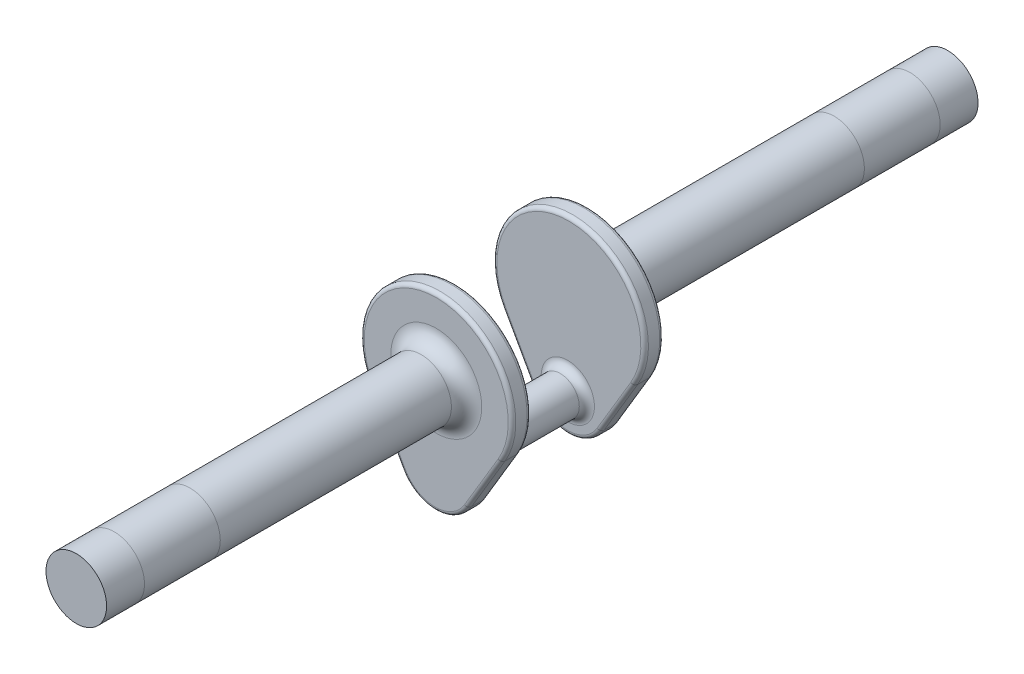
ISO-10303-21;
HEADER;
FILE_DESCRIPTION(('STEP AP214'),'2;1');
FILE_NAME('part.step','',(''),(''),'','','');
FILE_SCHEMA(('AUTOMOTIVE_DESIGN { 1 0 10303 214 1 1 1 1 }'));
ENDSEC;
DATA;
#1=APPLICATION_CONTEXT('core data for automotive mechanical design processes');
#2=APPLICATION_PROTOCOL_DEFINITION('international standard','automotive_design',2000,#1);
#3=PRODUCT_CONTEXT('',#1,'mechanical');
#4=PRODUCT('Part','Part','',(#3));
#5=PRODUCT_RELATED_PRODUCT_CATEGORY('part','',(#4));
#6=PRODUCT_DEFINITION_FORMATION('','',#4);
#7=PRODUCT_DEFINITION_CONTEXT('part definition',#1,'design');
#8=PRODUCT_DEFINITION('design','',#6,#7);
#9=PRODUCT_DEFINITION_SHAPE('','',#8);
#10=(LENGTH_UNIT() NAMED_UNIT(*) SI_UNIT(.MILLI.,.METRE.));
#11=(NAMED_UNIT(*) PLANE_ANGLE_UNIT() SI_UNIT($,.RADIAN.));
#12=(NAMED_UNIT(*) SI_UNIT($,.STERADIAN.) SOLID_ANGLE_UNIT());
#13=UNCERTAINTY_MEASURE_WITH_UNIT(LENGTH_MEASURE(1.E-05),#10,'distance_accuracy_value','');
#14=(GEOMETRIC_REPRESENTATION_CONTEXT(3) GLOBAL_UNCERTAINTY_ASSIGNED_CONTEXT((#13)) GLOBAL_UNIT_ASSIGNED_CONTEXT((#10,
#11,#12)) REPRESENTATION_CONTEXT('',''));
#15=CARTESIAN_POINT('',(0.,0.,0.));
#16=DIRECTION('',(0.,0.,1.));
#17=DIRECTION('',(1.,0.,0.));
#18=AXIS2_PLACEMENT_3D('',#15,#16,#17);
#19=CARTESIAN_POINT('',(0.,0.,-120.65));
#20=DIRECTION('',(0.,0.,1.));
#21=DIRECTION('',(1.,0.,0.));
#22=AXIS2_PLACEMENT_3D('',#19,#20,#21);
#23=CYLINDRICAL_SURFACE('',#22,10.1604447554047);
#24=CARTESIAN_POINT('',(0.,0.,-82.55));
#25=DIRECTION('',(0.,0.,-1.));
#26=DIRECTION('',(-1.,0.,0.));
#27=AXIS2_PLACEMENT_3D('',#24,#25,#26);
#28=CIRCLE('',#27,10.1604447554047);
#29=CARTESIAN_POINT('',(-10.1604447554047,0.,-82.55));
#30=VERTEX_POINT('',#29);
#31=EDGE_CURVE('E48',#30,#30,#28,.T.);
#32=ORIENTED_EDGE('',*,*,#31,.T.);
#33=EDGE_LOOP('',(#32));
#34=FACE_BOUND('',#33,.T.);
#35=CARTESIAN_POINT('',(0.,0.,-107.95));
#36=DIRECTION('',(0.,0.,-1.));
#37=DIRECTION('',(-1.,0.,0.));
#38=AXIS2_PLACEMENT_3D('',#35,#36,#37);
#39=CIRCLE('',#38,10.1604447554047);
#40=CARTESIAN_POINT('',(-10.1604447554047,0.,-107.95));
#41=VERTEX_POINT('',#40);
#42=EDGE_CURVE('E11',#41,#41,#39,.T.);
#43=ORIENTED_EDGE('',*,*,#42,.F.);
#44=EDGE_LOOP('',(#43));
#45=FACE_BOUND('',#44,.T.);
#46=ADVANCED_FACE('F39',(#34,#45),#23,.T.);
#47=CARTESIAN_POINT('',(0.,0.,-5.08));
#48=DIRECTION('',(0.,0.,1.));
#49=DIRECTION('',(1.,0.,0.));
#50=AXIS2_PLACEMENT_3D('',#47,#48,#49);
#51=CIRCLE('',#50,10.1604447554047);
#52=CARTESIAN_POINT('',(10.1604447554047,0.,-5.08));
#53=VERTEX_POINT('',#52);
#54=EDGE_CURVE('E268',#53,#53,#51,.F.);
#55=ORIENTED_EDGE('',*,*,#54,.T.);
#56=EDGE_LOOP('',(#55));
#57=FACE_BOUND('',#56,.T.);
#58=ORIENTED_EDGE('',*,*,#31,.F.);
#59=EDGE_LOOP('',(#58));
#60=FACE_BOUND('',#59,.T.);
#61=ADVANCED_FACE('F332',(#57,#60),#23,.T.);
#62=CARTESIAN_POINT('',(0.,0.,6.35));
#63=DIRECTION('',(0.,0.,1.));
#64=DIRECTION('',(1.,0.,0.));
#65=AXIS2_PLACEMENT_3D('',#62,#63,#64);
#66=PLANE('',#65);
#67=CARTESIAN_POINT('',(-0.358243610927282,-25.4,6.35));
#68=DIRECTION('',(0.,0.,1.));
#69=DIRECTION('',(1.,0.,0.));
#70=AXIS2_PLACEMENT_3D('',#67,#68,#69);
#71=CIRCLE('',#70,11.43);
#72=CARTESIAN_POINT('',(-10.3368464365435,-30.9742609957379,6.35));
#73=VERTEX_POINT('',#72);
#74=CARTESIAN_POINT('',(9.45918165202621,-31.2534657431579,6.35));
#75=VERTEX_POINT('',#74);
#76=EDGE_CURVE('E278',#73,#75,#71,.T.);
#77=ORIENTED_EDGE('',*,*,#76,.T.);
#78=DIRECTION('',(0.51211423824653,0.858917345840201,0.));
#79=VECTOR('',#78,1.);
#80=CARTESIAN_POINT('',(20.7256755551241,-12.3573165688888,6.35));
#81=LINE('',#80,#79);
#82=CARTESIAN_POINT('',(20.7256755551241,-12.3573165688888,6.35));
#83=VERTEX_POINT('',#82);
#84=EDGE_CURVE('E280',#75,#83,#81,.T.);
#85=ORIENTED_EDGE('',*,*,#84,.T.);
#86=CARTESIAN_POINT('',(0.,0.,6.35));
#87=DIRECTION('',(0.,0.,1.));
#88=DIRECTION('',(1.,0.,0.));
#89=AXIS2_PLACEMENT_3D('',#86,#87,#88);
#90=CIRCLE('',#89,24.13);
#91=CARTESIAN_POINT('',(-21.0659392985231,-11.7678843243355,6.35));
#92=VERTEX_POINT('',#91);
#93=EDGE_CURVE('E274',#83,#92,#90,.T.);
#94=ORIENTED_EDGE('',*,*,#93,.T.);
#95=DIRECTION('',(0.487686876267531,-0.873018619913927,0.));
#96=VECTOR('',#95,1.);
#97=CARTESIAN_POINT('',(-10.3368464365435,-30.9742609957379,6.35));
#98=LINE('',#97,#96);
#99=EDGE_CURVE('E276',#92,#73,#98,.T.);
#100=ORIENTED_EDGE('',*,*,#99,.T.);
#101=EDGE_LOOP('',(#77,#85,#94,#100));
#102=FACE_BOUND('',#101,.T.);
#103=CARTESIAN_POINT('',(-0.358243610927282,-25.4,6.35));
#104=DIRECTION('',(0.,0.,1.));
#105=DIRECTION('',(1.,0.,0.));
#106=AXIS2_PLACEMENT_3D('',#103,#104,#105);
#107=CIRCLE('',#106,8.92917244429606);
#108=CARTESIAN_POINT('',(8.57092883336878,-25.4,6.35));
#109=VERTEX_POINT('',#108);
#110=EDGE_CURVE('E265',#109,#109,#107,.F.);
#111=ORIENTED_EDGE('',*,*,#110,.T.);
#112=EDGE_LOOP('',(#111));
#113=FACE_BOUND('',#112,.T.);
#114=ADVANCED_FACE('F334',(#102,#113),#66,.T.);
#115=CARTESIAN_POINT('',(0.,0.,0.));
#116=DIRECTION('',(0.,0.,1.));
#117=DIRECTION('',(1.,0.,0.));
#118=AXIS2_PLACEMENT_3D('',#115,#116,#117);
#119=PLANE('',#118);
#120=CARTESIAN_POINT('',(0.,0.,0.));
#121=DIRECTION('',(0.,0.,1.));
#122=DIRECTION('',(1.,0.,0.));
#123=AXIS2_PLACEMENT_3D('',#120,#121,#122);
#124=CIRCLE('',#123,24.13);
#125=CARTESIAN_POINT('',(-21.0659392985231,-11.7678843243355,0.));
#126=VERTEX_POINT('',#125);
#127=CARTESIAN_POINT('',(20.7256755551241,-12.3573165688888,0.));
#128=VERTEX_POINT('',#127);
#129=EDGE_CURVE('E297',#126,#128,#124,.F.);
#130=ORIENTED_EDGE('',*,*,#129,.T.);
#131=DIRECTION('',(0.51211423824653,0.858917345840201,0.));
#132=VECTOR('',#131,1.);
#133=CARTESIAN_POINT('',(20.7256755551241,-12.3573165688888,0.));
#134=LINE('',#133,#132);
#135=CARTESIAN_POINT('',(9.45918165202621,-31.2534657431579,0.));
#136=VERTEX_POINT('',#135);
#137=EDGE_CURVE('E302',#128,#136,#134,.F.);
#138=ORIENTED_EDGE('',*,*,#137,.T.);
#139=CARTESIAN_POINT('',(-0.358243610927282,-25.4,0.));
#140=DIRECTION('',(0.,0.,1.));
#141=DIRECTION('',(1.,0.,0.));
#142=AXIS2_PLACEMENT_3D('',#139,#140,#141);
#143=CIRCLE('',#142,11.43);
#144=CARTESIAN_POINT('',(-10.3368464365435,-30.9742609957379,0.));
#145=VERTEX_POINT('',#144);
#146=EDGE_CURVE('E62',#136,#145,#143,.F.);
#147=ORIENTED_EDGE('',*,*,#146,.T.);
#148=DIRECTION('',(0.487686876267531,-0.873018619913927,0.));
#149=VECTOR('',#148,1.);
#150=CARTESIAN_POINT('',(-21.0659392985231,-11.7678843243355,0.));
#151=LINE('',#150,#149);
#152=EDGE_CURVE('E299',#145,#126,#151,.F.);
#153=ORIENTED_EDGE('',*,*,#152,.T.);
#154=EDGE_LOOP('',(#130,#138,#147,#153));
#155=FACE_BOUND('',#154,.T.);
#156=CARTESIAN_POINT('',(0.,0.,0.));
#157=DIRECTION('',(0.,0.,1.));
#158=DIRECTION('',(1.,0.,0.));
#159=AXIS2_PLACEMENT_3D('',#156,#157,#158);
#160=CIRCLE('',#159,15.2404447554047);
#161=CARTESIAN_POINT('',(15.2404447554047,0.,0.));
#162=VERTEX_POINT('',#161);
#163=EDGE_CURVE('E271',#162,#162,#160,.T.);
#164=ORIENTED_EDGE('',*,*,#163,.T.);
#165=EDGE_LOOP('',(#164));
#166=FACE_BOUND('',#165,.T.);
#167=ADVANCED_FACE('F342',(#155,#166),#119,.F.);
#168=CARTESIAN_POINT('',(0.,0.,6.35));
#169=DIRECTION('',(0.,0.,-1.));
#170=DIRECTION('',(-1.,0.,0.));
#171=AXIS2_PLACEMENT_3D('',#168,#169,#170);
#172=CYLINDRICAL_SURFACE('',#171,25.4);
#173=DIRECTION('',(0.,0.,-1.));
#174=VECTOR('',#173,1.);
#175=CARTESIAN_POINT('',(-22.1746729458138,-12.3872466571953,6.35));
#176=LINE('',#175,#174);
#177=CARTESIAN_POINT('',(-22.1746729458138,-12.3872466571953,5.08));
#178=VERTEX_POINT('',#177);
#179=CARTESIAN_POINT('',(-22.1746729458138,-12.3872466571953,1.27));
#180=VERTEX_POINT('',#179);
#181=EDGE_CURVE('E259',#178,#180,#176,.T.);
#182=ORIENTED_EDGE('',*,*,#181,.F.);
#183=CARTESIAN_POINT('',(0.,0.,5.08));
#184=DIRECTION('',(0.,0.,1.));
#185=DIRECTION('',(1.,0.,0.));
#186=AXIS2_PLACEMENT_3D('',#183,#184,#185);
#187=CIRCLE('',#186,25.4);
#188=CARTESIAN_POINT('',(21.8165005843411,-13.0077016514619,5.08));
#189=VERTEX_POINT('',#188);
#190=EDGE_CURVE('E306',#178,#189,#187,.F.);
#191=ORIENTED_EDGE('',*,*,#190,.T.);
#192=DIRECTION('',(0.,0.,-1.));
#193=VECTOR('',#192,1.);
#194=CARTESIAN_POINT('',(21.8165005843411,-13.0077016514619,6.35));
#195=LINE('',#194,#193);
#196=CARTESIAN_POINT('',(21.8165005843411,-13.0077016514619,1.27));
#197=VERTEX_POINT('',#196);
#198=EDGE_CURVE('E249',#189,#197,#195,.T.);
#199=ORIENTED_EDGE('',*,*,#198,.T.);
#200=CARTESIAN_POINT('',(0.,0.,1.27));
#201=DIRECTION('',(0.,0.,1.));
#202=DIRECTION('',(1.,0.,0.));
#203=AXIS2_PLACEMENT_3D('',#200,#201,#202);
#204=CIRCLE('',#203,25.4);
#205=EDGE_CURVE('E304',#197,#180,#204,.T.);
#206=ORIENTED_EDGE('',*,*,#205,.T.);
#207=EDGE_LOOP('',(#182,#191,#199,#206));
#208=FACE_BOUND('',#207,.T.);
#209=ADVANCED_FACE('F373',(#208),#172,.T.);
#210=CARTESIAN_POINT('',(-22.1746729458138,-12.3872466571953,6.35));
#211=DIRECTION('',(0.873018619913927,0.487686876267531,0.));
#212=DIRECTION('',(-0.487686876267531,0.873018619913927,0.));
#213=AXIS2_PLACEMENT_3D('',#210,#211,#212);
#214=PLANE('',#213);
#215=DIRECTION('',(0.,0.,-1.));
#216=VECTOR('',#215,1.);
#217=CARTESIAN_POINT('',(-11.4455800838342,-31.5936233285976,6.35));
#218=LINE('',#217,#216);
#219=CARTESIAN_POINT('',(-11.4455800838342,-31.5936233285976,5.08));
#220=VERTEX_POINT('',#219);
#221=CARTESIAN_POINT('',(-11.4455800838342,-31.5936233285976,1.27));
#222=VERTEX_POINT('',#221);
#223=EDGE_CURVE('E256',#220,#222,#218,.T.);
#224=ORIENTED_EDGE('',*,*,#223,.F.);
#225=DIRECTION('',(0.487686876267531,-0.873018619913927,0.));
#226=VECTOR('',#225,1.);
#227=CARTESIAN_POINT('',(-22.1746729458138,-12.3872466571953,5.08));
#228=LINE('',#227,#226);
#229=EDGE_CURVE('E295',#220,#178,#228,.F.);
#230=ORIENTED_EDGE('',*,*,#229,.T.);
#231=ORIENTED_EDGE('',*,*,#181,.T.);
#232=DIRECTION('',(0.487686876267531,-0.873018619913927,0.));
#233=VECTOR('',#232,1.);
#234=CARTESIAN_POINT('',(-22.1746729458138,-12.3872466571953,1.27));
#235=LINE('',#234,#233);
#236=EDGE_CURVE('E293',#180,#222,#235,.T.);
#237=ORIENTED_EDGE('',*,*,#236,.T.);
#238=EDGE_LOOP('',(#224,#230,#231,#237));
#239=FACE_BOUND('',#238,.T.);
#240=ADVANCED_FACE('F365',(#239),#214,.F.);
#241=CARTESIAN_POINT('',(-0.358243610927282,-25.4,6.35));
#242=DIRECTION('',(0.,0.,-1.));
#243=DIRECTION('',(-1.,0.,0.));
#244=AXIS2_PLACEMENT_3D('',#241,#242,#243);
#245=CYLINDRICAL_SURFACE('',#244,12.7);
#246=DIRECTION('',(0.,0.,-1.));
#247=VECTOR('',#246,1.);
#248=CARTESIAN_POINT('',(10.5500066812433,-31.9038508257309,6.35));
#249=LINE('',#248,#247);
#250=CARTESIAN_POINT('',(10.5500066812433,-31.9038508257309,5.08));
#251=VERTEX_POINT('',#250);
#252=CARTESIAN_POINT('',(10.5500066812433,-31.9038508257309,1.27));
#253=VERTEX_POINT('',#252);
#254=EDGE_CURVE('E253',#251,#253,#249,.T.);
#255=ORIENTED_EDGE('',*,*,#254,.F.);
#256=CARTESIAN_POINT('',(-0.358243610927282,-25.4,5.08));
#257=DIRECTION('',(0.,0.,1.));
#258=DIRECTION('',(1.,0.,0.));
#259=AXIS2_PLACEMENT_3D('',#256,#257,#258);
#260=CIRCLE('',#259,12.7);
#261=EDGE_CURVE('E291',#251,#220,#260,.F.);
#262=ORIENTED_EDGE('',*,*,#261,.T.);
#263=ORIENTED_EDGE('',*,*,#223,.T.);
#264=CARTESIAN_POINT('',(-0.358243610927282,-25.4,1.27));
#265=DIRECTION('',(0.,0.,1.));
#266=DIRECTION('',(1.,0.,0.));
#267=AXIS2_PLACEMENT_3D('',#264,#265,#266);
#268=CIRCLE('',#267,12.7);
#269=EDGE_CURVE('E289',#222,#253,#268,.T.);
#270=ORIENTED_EDGE('',*,*,#269,.T.);
#271=EDGE_LOOP('',(#255,#262,#263,#270));
#272=FACE_BOUND('',#271,.T.);
#273=ADVANCED_FACE('F356',(#272),#245,.T.);
#274=CARTESIAN_POINT('',(21.8165005843411,-13.0077016514619,6.35));
#275=DIRECTION('',(-0.858917345840201,0.51211423824653,0.));
#276=DIRECTION('',(-0.51211423824653,-0.858917345840201,0.));
#277=AXIS2_PLACEMENT_3D('',#274,#275,#276);
#278=PLANE('',#277);
#279=ORIENTED_EDGE('',*,*,#198,.F.);
#280=DIRECTION('',(0.51211423824653,0.858917345840201,0.));
#281=VECTOR('',#280,1.);
#282=CARTESIAN_POINT('',(10.5500066812433,-31.9038508257309,5.08));
#283=LINE('',#282,#281);
#284=EDGE_CURVE('E286',#189,#251,#283,.F.);
#285=ORIENTED_EDGE('',*,*,#284,.T.);
#286=ORIENTED_EDGE('',*,*,#254,.T.);
#287=DIRECTION('',(0.51211423824653,0.858917345840201,0.));
#288=VECTOR('',#287,1.);
#289=CARTESIAN_POINT('',(21.8165005843411,-13.0077016514619,1.27));
#290=LINE('',#289,#288);
#291=EDGE_CURVE('E283',#253,#197,#290,.T.);
#292=ORIENTED_EDGE('',*,*,#291,.T.);
#293=EDGE_LOOP('',(#279,#285,#286,#292));
#294=FACE_BOUND('',#293,.T.);
#295=ADVANCED_FACE('F348',(#294),#278,.F.);
#296=ORIENTED_EDGE('',*,*,#42,.T.);
#297=EDGE_LOOP('',(#296));
#298=FACE_BOUND('',#297,.T.);
#299=CARTESIAN_POINT('',(0.,0.,-120.65));
#300=DIRECTION('',(0.,0.,-1.));
#301=DIRECTION('',(-1.,0.,0.));
#302=AXIS2_PLACEMENT_3D('',#299,#300,#301);
#303=CIRCLE('',#302,10.1604447554047);
#304=CARTESIAN_POINT('',(-10.1604447554047,0.,-120.65));
#305=VERTEX_POINT('',#304);
#306=EDGE_CURVE('E246',#305,#305,#303,.T.);
#307=ORIENTED_EDGE('',*,*,#306,.F.);
#308=EDGE_LOOP('',(#307));
#309=FACE_BOUND('',#308,.T.);
#310=ADVANCED_FACE('F337',(#298,#309),#23,.T.);
#311=CARTESIAN_POINT('',(0.,0.,-120.65));
#312=DIRECTION('',(0.,0.,-1.));
#313=DIRECTION('',(-1.,0.,0.));
#314=AXIS2_PLACEMENT_3D('',#311,#312,#313);
#315=PLANE('',#314);
#316=ORIENTED_EDGE('',*,*,#306,.T.);
#317=EDGE_LOOP('',(#316));
#318=FACE_BOUND('',#317,.T.);
#319=ADVANCED_FACE('F347',(#318),#315,.T.);
#320=CARTESIAN_POINT('',(-0.358243610927282,-25.4,25.4));
#321=DIRECTION('',(0.,0.,-1.));
#322=DIRECTION('',(-1.,0.,0.));
#323=AXIS2_PLACEMENT_3D('',#320,#321,#322);
#324=CYLINDRICAL_SURFACE('',#323,6.38917244429606);
#325=CARTESIAN_POINT('',(-0.358243610927282,-25.4,8.89));
#326=DIRECTION('',(0.,0.,1.));
#327=DIRECTION('',(1.,0.,0.));
#328=AXIS2_PLACEMENT_3D('',#325,#326,#327);
#329=CIRCLE('',#328,6.38917244429606);
#330=CARTESIAN_POINT('',(-6.74741605522334,-25.4,8.89));
#331=VERTEX_POINT('',#330);
#332=EDGE_CURVE('E262',#331,#331,#329,.T.);
#333=CARTESIAN_POINT('',(-0.358243610927282,-25.4,41.91));
#334=DIRECTION('',(0.,0.,1.));
#335=DIRECTION('',(1.,0.,0.));
#336=AXIS2_PLACEMENT_3D('',#333,#334,#335);
#337=CIRCLE('',#336,6.38917244429606);
#338=CARTESIAN_POINT('',(-6.74741605522334,-25.4,41.91));
#339=VERTEX_POINT('',#338);
#340=EDGE_CURVE('E449',#339,#339,#337,.T.);
#341=CARTESIAN_POINT('',(-6.74741605522334,-25.4,8.89));
#342=CARTESIAN_POINT('',(-6.74741605522334,-25.4,9.23395833333333));
#343=CARTESIAN_POINT('',(-6.74741605522334,-25.4,9.57791666666666));
#344=CARTESIAN_POINT('',(-6.74741605522334,-25.4,10.2658333333333));
#345=CARTESIAN_POINT('',(-6.74741605522334,-25.4,10.6097916666667));
#346=CARTESIAN_POINT('',(-6.74741605522334,-25.4,11.2977083333333));
#347=CARTESIAN_POINT('',(-6.74741605522334,-25.4,11.6416666666667));
#348=CARTESIAN_POINT('',(-6.74741605522334,-25.4,12.3295833333333));
#349=CARTESIAN_POINT('',(-6.74741605522334,-25.4,12.6735416666667));
#350=CARTESIAN_POINT('',(-6.74741605522334,-25.4,13.3614583333333));
#351=CARTESIAN_POINT('',(-6.74741605522334,-25.4,13.7054166666667));
#352=CARTESIAN_POINT('',(-6.74741605522334,-25.4,14.3933333333333));
#353=CARTESIAN_POINT('',(-6.74741605522334,-25.4,14.7372916666667));
#354=CARTESIAN_POINT('',(-6.74741605522334,-25.4,15.4252083333333));
#355=CARTESIAN_POINT('',(-6.74741605522334,-25.4,15.7691666666667));
#356=CARTESIAN_POINT('',(-6.74741605522334,-25.4,16.4570833333333));
#357=CARTESIAN_POINT('',(-6.74741605522334,-25.4,16.8010416666667));
#358=CARTESIAN_POINT('',(-6.74741605522334,-25.4,17.4889583333333));
#359=CARTESIAN_POINT('',(-6.74741605522334,-25.4,17.8329166666667));
#360=CARTESIAN_POINT('',(-6.74741605522334,-25.4,18.5208333333333));
#361=CARTESIAN_POINT('',(-6.74741605522334,-25.4,18.8647916666667));
#362=CARTESIAN_POINT('',(-6.74741605522334,-25.4,19.5527083333333));
#363=CARTESIAN_POINT('',(-6.74741605522334,-25.4,19.8966666666667));
#364=CARTESIAN_POINT('',(-6.74741605522334,-25.4,20.5845833333333));
#365=CARTESIAN_POINT('',(-6.74741605522334,-25.4,20.9285416666667));
#366=CARTESIAN_POINT('',(-6.74741605522334,-25.4,21.6164583333333));
#367=CARTESIAN_POINT('',(-6.74741605522334,-25.4,21.9604166666667));
#368=CARTESIAN_POINT('',(-6.74741605522334,-25.4,22.6483333333333));
#369=CARTESIAN_POINT('',(-6.74741605522334,-25.4,22.9922916666667));
#370=CARTESIAN_POINT('',(-6.74741605522334,-25.4,23.6802083333333));
#371=CARTESIAN_POINT('',(-6.74741605522334,-25.4,24.0241666666667));
#372=CARTESIAN_POINT('',(-6.74741605522334,-25.4,24.7120833333333));
#373=CARTESIAN_POINT('',(-6.74741605522334,-25.4,25.0560416666667));
#374=CARTESIAN_POINT('',(-6.74741605522334,-25.4,25.7439583333333));
#375=CARTESIAN_POINT('',(-6.74741605522334,-25.4,26.0879166666667));
#376=CARTESIAN_POINT('',(-6.74741605522334,-25.4,26.7758333333333));
#377=CARTESIAN_POINT('',(-6.74741605522334,-25.4,27.1197916666667));
#378=CARTESIAN_POINT('',(-6.74741605522334,-25.4,27.8077083333333));
#379=CARTESIAN_POINT('',(-6.74741605522334,-25.4,28.1516666666667));
#380=CARTESIAN_POINT('',(-6.74741605522334,-25.4,28.8395833333333));
#381=CARTESIAN_POINT('',(-6.74741605522334,-25.4,29.1835416666667));
#382=CARTESIAN_POINT('',(-6.74741605522334,-25.4,29.8714583333333));
#383=CARTESIAN_POINT('',(-6.74741605522334,-25.4,30.2154166666667));
#384=CARTESIAN_POINT('',(-6.74741605522334,-25.4,30.9033333333333));
#385=CARTESIAN_POINT('',(-6.74741605522334,-25.4,31.2472916666667));
#386=CARTESIAN_POINT('',(-6.74741605522334,-25.4,31.9352083333333));
#387=CARTESIAN_POINT('',(-6.74741605522334,-25.4,32.2791666666667));
#388=CARTESIAN_POINT('',(-6.74741605522334,-25.4,32.9670833333333));
#389=CARTESIAN_POINT('',(-6.74741605522334,-25.4,33.3110416666667));
#390=CARTESIAN_POINT('',(-6.74741605522334,-25.4,33.9989583333333));
#391=CARTESIAN_POINT('',(-6.74741605522334,-25.4,34.3429166666667));
#392=CARTESIAN_POINT('',(-6.74741605522334,-25.4,35.0308333333333));
#393=CARTESIAN_POINT('',(-6.74741605522334,-25.4,35.3747916666667));
#394=CARTESIAN_POINT('',(-6.74741605522334,-25.4,36.0627083333333));
#395=CARTESIAN_POINT('',(-6.74741605522334,-25.4,36.4066666666667));
#396=CARTESIAN_POINT('',(-6.74741605522334,-25.4,37.0945833333333));
#397=CARTESIAN_POINT('',(-6.74741605522334,-25.4,37.4385416666667));
#398=CARTESIAN_POINT('',(-6.74741605522334,-25.4,38.1264583333333));
#399=CARTESIAN_POINT('',(-6.74741605522334,-25.4,38.4704166666667));
#400=CARTESIAN_POINT('',(-6.74741605522334,-25.4,39.1583333333333));
#401=CARTESIAN_POINT('',(-6.74741605522334,-25.4,39.5022916666667));
#402=CARTESIAN_POINT('',(-6.74741605522334,-25.4,40.1902083333333));
#403=CARTESIAN_POINT('',(-6.74741605522334,-25.4,40.5341666666667));
#404=CARTESIAN_POINT('',(-6.74741605522334,-25.4,41.2220833333333));
#405=CARTESIAN_POINT('',(-6.74741605522334,-25.4,41.5660416666667));
#406=CARTESIAN_POINT('',(-6.74741605522334,-25.4,41.91));
#407=B_SPLINE_CURVE_WITH_KNOTS('',3,(#341,#342,#343,#344,#345,#346,#347,#348,#349,#350,#351,
#352,#353,#354,#355,#356,#357,#358,#359,#360,#361,#362,#363,#364,#365,#366,#367,#368,#369,#370,
#371,#372,#373,#374,#375,#376,#377,#378,#379,#380,#381,#382,#383,#384,#385,#386,#387,#388,#389,
#390,#391,#392,#393,#394,#395,#396,#397,#398,#399,#400,#401,#402,#403,#404,#405,#406),
.UNSPECIFIED.,.F.,.F.,(4,2,2,2,2,2,2,2,2,2,2,2,2,2,2,2,2,2,2,2,2,2,2,2,2,2,2,2,2,2,2,2,4),(0.,
1.031875,2.06375,3.095625,4.1275,5.159375,6.19125,7.223125,8.255,9.286875,10.31875,11.350625,
12.3825,13.414375,14.44625,15.478125,16.51,17.541875,18.57375,19.605625,20.6375,21.669375,
22.70125,23.733125,24.765,25.796875,26.82875,27.860625,28.8925,29.924375,30.95625,31.988125,
33.02),.UNSPECIFIED.);
#408=EDGE_CURVE('BSEAM354',#331,#339,#407,.T.);
#409=ORIENTED_EDGE('',*,*,#332,.T.);
#410=ORIENTED_EDGE('',*,*,#340,.F.);
#411=ORIENTED_EDGE('',*,*,#408,.T.);
#412=ORIENTED_EDGE('',*,*,#408,.F.);
#413=EDGE_LOOP('',(#409,#411,#410,#412));
#414=FACE_BOUND('',#413,.T.);
#415=ADVANCED_FACE('F354',(#414),#324,.T.);
#416=CARTESIAN_POINT('',(-0.358243610927282,-25.4,8.89));
#417=DIRECTION('',(0.,0.,1.));
#418=DIRECTION('',(1.,0.,0.));
#419=AXIS2_PLACEMENT_3D('',#416,#417,#418);
#420=TOROIDAL_SURFACE('',#419,8.92917244429606,2.54);
#421=ORIENTED_EDGE('',*,*,#110,.F.);
#422=EDGE_LOOP('',(#421));
#423=FACE_BOUND('',#422,.T.);
#424=ORIENTED_EDGE('',*,*,#332,.F.);
#425=EDGE_LOOP('',(#424));
#426=FACE_BOUND('',#425,.T.);
#427=ADVANCED_FACE('F378',(#423,#426),#420,.F.);
#428=CARTESIAN_POINT('',(0.,0.,-5.08));
#429=DIRECTION('',(0.,0.,1.));
#430=DIRECTION('',(1.,0.,0.));
#431=AXIS2_PLACEMENT_3D('',#428,#429,#430);
#432=TOROIDAL_SURFACE('',#431,15.2404447554047,5.08);
#433=ORIENTED_EDGE('',*,*,#163,.F.);
#434=EDGE_LOOP('',(#433));
#435=FACE_BOUND('',#434,.T.);
#436=ORIENTED_EDGE('',*,*,#54,.F.);
#437=EDGE_LOOP('',(#436));
#438=FACE_BOUND('',#437,.T.);
#439=ADVANCED_FACE('F381',(#435,#438),#432,.F.);
#440=CARTESIAN_POINT('',(-21.0659392985231,-11.7678843243355,5.08));
#441=DIRECTION('',(-0.487686876267531,0.873018619913927,0.));
#442=DIRECTION('',(-0.873018619913927,-0.487686876267531,0.));
#443=AXIS2_PLACEMENT_3D('',#440,#441,#442);
#444=CYLINDRICAL_SURFACE('',#443,1.27);
#445=CARTESIAN_POINT('',(-21.0659392985231,-11.7678843243355,5.08));
#446=DIRECTION('',(-0.487686876267531,0.873018619913927,0.));
#447=DIRECTION('',(-0.873018619913927,-0.487686876267531,0.));
#448=AXIS2_PLACEMENT_3D('',#445,#446,#447);
#449=CIRCLE('',#448,1.27);
#450=EDGE_CURVE('E313',#178,#92,#449,.T.);
#451=ORIENTED_EDGE('',*,*,#450,.F.);
#452=ORIENTED_EDGE('',*,*,#229,.F.);
#453=CARTESIAN_POINT('',(-10.3368464365435,-30.9742609957379,5.08));
#454=DIRECTION('',(0.487686876267529,-0.873018619913928,0.));
#455=DIRECTION('',(0.873018619913928,0.487686876267529,0.));
#456=AXIS2_PLACEMENT_3D('',#453,#454,#455);
#457=CIRCLE('',#456,1.27);
#458=EDGE_CURVE('E250',#73,#220,#457,.T.);
#459=ORIENTED_EDGE('',*,*,#458,.F.);
#460=ORIENTED_EDGE('',*,*,#99,.F.);
#461=EDGE_LOOP('',(#451,#452,#459,#460));
#462=FACE_BOUND('',#461,.T.);
#463=ADVANCED_FACE('F385',(#462),#444,.T.);
#464=CARTESIAN_POINT('',(-0.358243610927282,-25.4,5.08));
#465=DIRECTION('',(0.,0.,1.));
#466=DIRECTION('',(1.,0.,0.));
#467=AXIS2_PLACEMENT_3D('',#464,#465,#466);
#468=TOROIDAL_SURFACE('',#467,11.43,1.27);
#469=ORIENTED_EDGE('',*,*,#458,.T.);
#470=ORIENTED_EDGE('',*,*,#261,.F.);
#471=CARTESIAN_POINT('',(9.45918165202621,-31.2534657431579,5.08));
#472=DIRECTION('',(0.512114238246528,0.858917345840203,0.));
#473=DIRECTION('',(-0.858917345840203,0.512114238246528,0.));
#474=AXIS2_PLACEMENT_3D('',#471,#472,#473);
#475=CIRCLE('',#474,1.27);
#476=EDGE_CURVE('E310',#75,#251,#475,.T.);
#477=ORIENTED_EDGE('',*,*,#476,.F.);
#478=ORIENTED_EDGE('',*,*,#76,.F.);
#479=EDGE_LOOP('',(#469,#470,#477,#478));
#480=FACE_BOUND('',#479,.T.);
#481=ADVANCED_FACE('F394',(#480),#468,.T.);
#482=CARTESIAN_POINT('',(0.,0.,5.08));
#483=DIRECTION('',(0.,0.,1.));
#484=DIRECTION('',(1.,0.,0.));
#485=AXIS2_PLACEMENT_3D('',#482,#483,#484);
#486=TOROIDAL_SURFACE('',#485,24.13,1.27);
#487=ORIENTED_EDGE('',*,*,#450,.T.);
#488=ORIENTED_EDGE('',*,*,#93,.F.);
#489=CARTESIAN_POINT('',(20.7256755551241,-12.3573165688888,5.08));
#490=DIRECTION('',(-0.512114238246531,-0.858917345840201,0.));
#491=DIRECTION('',(0.858917345840201,-0.512114238246531,0.));
#492=AXIS2_PLACEMENT_3D('',#489,#490,#491);
#493=CIRCLE('',#492,1.27);
#494=EDGE_CURVE('E308',#189,#83,#493,.T.);
#495=ORIENTED_EDGE('',*,*,#494,.F.);
#496=ORIENTED_EDGE('',*,*,#190,.F.);
#497=EDGE_LOOP('',(#487,#488,#495,#496));
#498=FACE_BOUND('',#497,.T.);
#499=ADVANCED_FACE('F390',(#498),#486,.T.);
#500=CARTESIAN_POINT('',(20.7256755551241,-12.3573165688888,5.08));
#501=DIRECTION('',(-0.51211423824653,-0.858917345840201,0.));
#502=DIRECTION('',(0.858917345840201,-0.51211423824653,0.));
#503=AXIS2_PLACEMENT_3D('',#500,#501,#502);
#504=CYLINDRICAL_SURFACE('',#503,1.27);
#505=ORIENTED_EDGE('',*,*,#476,.T.);
#506=ORIENTED_EDGE('',*,*,#284,.F.);
#507=ORIENTED_EDGE('',*,*,#494,.T.);
#508=ORIENTED_EDGE('',*,*,#84,.F.);
#509=EDGE_LOOP('',(#505,#506,#507,#508));
#510=FACE_BOUND('',#509,.T.);
#511=ADVANCED_FACE('F387',(#510),#504,.T.);
#512=CARTESIAN_POINT('',(-21.0659392985231,-11.7678843243355,1.27));
#513=DIRECTION('',(0.487686876267531,-0.873018619913927,0.));
#514=DIRECTION('',(0.873018619913927,0.487686876267531,0.));
#515=AXIS2_PLACEMENT_3D('',#512,#513,#514);
#516=CYLINDRICAL_SURFACE('',#515,1.27);
#517=CARTESIAN_POINT('',(-21.0659392985231,-11.7678843243355,1.27));
#518=DIRECTION('',(-0.487686876267531,0.873018619913927,0.));
#519=DIRECTION('',(-0.873018619913927,-0.487686876267531,0.));
#520=AXIS2_PLACEMENT_3D('',#517,#518,#519);
#521=CIRCLE('',#520,1.27);
#522=EDGE_CURVE('E320',#126,#180,#521,.T.);
#523=ORIENTED_EDGE('',*,*,#522,.F.);
#524=ORIENTED_EDGE('',*,*,#152,.F.);
#525=CARTESIAN_POINT('',(-10.3368464365435,-30.9742609957379,1.27));
#526=DIRECTION('',(0.487686876267532,-0.873018619913926,0.));
#527=DIRECTION('',(0.873018619913927,0.487686876267532,0.));
#528=AXIS2_PLACEMENT_3D('',#525,#526,#527);
#529=CIRCLE('',#528,1.27);
#530=EDGE_CURVE('E311',#222,#145,#529,.T.);
#531=ORIENTED_EDGE('',*,*,#530,.F.);
#532=ORIENTED_EDGE('',*,*,#236,.F.);
#533=EDGE_LOOP('',(#523,#524,#531,#532));
#534=FACE_BOUND('',#533,.T.);
#535=ADVANCED_FACE('F41',(#534),#516,.T.);
#536=CARTESIAN_POINT('',(-0.358243610927282,-25.4,1.27));
#537=DIRECTION('',(0.,0.,1.));
#538=DIRECTION('',(1.,0.,0.));
#539=AXIS2_PLACEMENT_3D('',#536,#537,#538);
#540=TOROIDAL_SURFACE('',#539,11.43,1.27);
#541=ORIENTED_EDGE('',*,*,#530,.T.);
#542=ORIENTED_EDGE('',*,*,#146,.F.);
#543=CARTESIAN_POINT('',(9.45918165202622,-31.2534657431578,1.27));
#544=DIRECTION('',(0.512114238246533,0.8589173458402,0.));
#545=DIRECTION('',(-0.8589173458402,0.512114238246533,0.));
#546=AXIS2_PLACEMENT_3D('',#543,#544,#545);
#547=CIRCLE('',#546,1.27);
#548=EDGE_CURVE('E55',#253,#136,#547,.T.);
#549=ORIENTED_EDGE('',*,*,#548,.F.);
#550=ORIENTED_EDGE('',*,*,#269,.F.);
#551=EDGE_LOOP('',(#541,#542,#549,#550));
#552=FACE_BOUND('',#551,.T.);
#553=ADVANCED_FACE('F408',(#552),#540,.T.);
#554=CARTESIAN_POINT('',(0.,0.,1.27));
#555=DIRECTION('',(0.,0.,1.));
#556=DIRECTION('',(1.,0.,0.));
#557=AXIS2_PLACEMENT_3D('',#554,#555,#556);
#558=TOROIDAL_SURFACE('',#557,24.13,1.27);
#559=ORIENTED_EDGE('',*,*,#522,.T.);
#560=ORIENTED_EDGE('',*,*,#205,.F.);
#561=CARTESIAN_POINT('',(20.7256755551241,-12.3573165688888,1.27));
#562=DIRECTION('',(-0.512114238246531,-0.858917345840201,0.));
#563=DIRECTION('',(0.858917345840201,-0.512114238246531,0.));
#564=AXIS2_PLACEMENT_3D('',#561,#562,#563);
#565=CIRCLE('',#564,1.27);
#566=EDGE_CURVE('E245',#128,#197,#565,.T.);
#567=ORIENTED_EDGE('',*,*,#566,.F.);
#568=ORIENTED_EDGE('',*,*,#129,.F.);
#569=EDGE_LOOP('',(#559,#560,#567,#568));
#570=FACE_BOUND('',#569,.T.);
#571=ADVANCED_FACE('F406',(#570),#558,.T.);
#572=CARTESIAN_POINT('',(20.7256755551241,-12.3573165688888,1.27));
#573=DIRECTION('',(0.51211423824653,0.858917345840201,0.));
#574=DIRECTION('',(-0.858917345840201,0.51211423824653,0.));
#575=AXIS2_PLACEMENT_3D('',#572,#573,#574);
#576=CYLINDRICAL_SURFACE('',#575,1.27);
#577=ORIENTED_EDGE('',*,*,#548,.T.);
#578=ORIENTED_EDGE('',*,*,#137,.F.);
#579=ORIENTED_EDGE('',*,*,#566,.T.);
#580=ORIENTED_EDGE('',*,*,#291,.F.);
#581=EDGE_LOOP('',(#577,#578,#579,#580));
#582=FACE_BOUND('',#581,.T.);
#583=ADVANCED_FACE('F402',(#582),#576,.T.);
#584=CARTESIAN_POINT('',(0.,0.,171.45));
#585=DIRECTION('',(0.,0.,-1.));
#586=DIRECTION('',(1.,0.,0.));
#587=AXIS2_PLACEMENT_3D('',#584,#585,#586);
#588=CYLINDRICAL_SURFACE('',#587,10.1604447554047);
#589=CARTESIAN_POINT('',(0.,0.,133.35));
#590=DIRECTION('',(0.,0.,-1.));
#591=DIRECTION('',(-1.,0.,0.));
#592=AXIS2_PLACEMENT_3D('',#589,#590,#591);
#593=CIRCLE('',#592,10.1604447554047);
#594=CARTESIAN_POINT('',(-10.1604447554047,0.,133.35));
#595=VERTEX_POINT('',#594);
#596=EDGE_CURVE('E223',#595,#595,#593,.T.);
#597=ORIENTED_EDGE('',*,*,#596,.F.);
#598=EDGE_LOOP('',(#597));
#599=FACE_BOUND('',#598,.T.);
#600=CARTESIAN_POINT('',(0.,0.,158.75));
#601=DIRECTION('',(0.,0.,-1.));
#602=DIRECTION('',(-1.,0.,0.));
#603=AXIS2_PLACEMENT_3D('',#600,#601,#602);
#604=CIRCLE('',#603,10.1604447554047);
#605=CARTESIAN_POINT('',(-10.1604447554047,0.,158.75));
#606=VERTEX_POINT('',#605);
#607=EDGE_CURVE('E241',#606,#606,#604,.T.);
#608=ORIENTED_EDGE('',*,*,#607,.T.);
#609=EDGE_LOOP('',(#608));
#610=FACE_BOUND('',#609,.T.);
#611=ADVANCED_FACE('F405',(#599,#610),#588,.T.);
#612=CARTESIAN_POINT('',(0.,0.,55.88));
#613=DIRECTION('',(0.,0.,1.));
#614=DIRECTION('',(1.,0.,0.));
#615=AXIS2_PLACEMENT_3D('',#612,#613,#614);
#616=CIRCLE('',#615,10.1604447554047);
#617=CARTESIAN_POINT('',(10.1604447554047,0.,55.88));
#618=VERTEX_POINT('',#617);
#619=EDGE_CURVE('E187',#618,#618,#616,.F.);
#620=ORIENTED_EDGE('',*,*,#619,.F.);
#621=EDGE_LOOP('',(#620));
#622=FACE_BOUND('',#621,.T.);
#623=ORIENTED_EDGE('',*,*,#596,.T.);
#624=EDGE_LOOP('',(#623));
#625=FACE_BOUND('',#624,.T.);
#626=ADVANCED_FACE('F465',(#622,#625),#588,.T.);
#627=CARTESIAN_POINT('',(0.,0.,44.45));
#628=DIRECTION('',(0.,0.,-1.));
#629=DIRECTION('',(1.,0.,0.));
#630=AXIS2_PLACEMENT_3D('',#627,#628,#629);
#631=PLANE('',#630);
#632=CARTESIAN_POINT('',(-0.358243610927282,-25.4,44.45));
#633=DIRECTION('',(0.,0.,1.));
#634=DIRECTION('',(1.,0.,0.));
#635=AXIS2_PLACEMENT_3D('',#632,#633,#634);
#636=CIRCLE('',#635,11.43);
#637=CARTESIAN_POINT('',(-10.3368464365435,-30.9742609957379,44.45));
#638=VERTEX_POINT('',#637);
#639=CARTESIAN_POINT('',(9.45918165202621,-31.2534657431579,44.45));
#640=VERTEX_POINT('',#639);
#641=EDGE_CURVE('E177',#638,#640,#636,.T.);
#642=ORIENTED_EDGE('',*,*,#641,.F.);
#643=DIRECTION('',(0.487686876267531,-0.873018619913927,0.));
#644=VECTOR('',#643,1.);
#645=CARTESIAN_POINT('',(-10.3368464365435,-30.9742609957379,44.45));
#646=LINE('',#645,#644);
#647=CARTESIAN_POINT('',(-21.0659392985231,-11.7678843243355,44.45));
#648=VERTEX_POINT('',#647);
#649=EDGE_CURVE('E182',#648,#638,#646,.T.);
#650=ORIENTED_EDGE('',*,*,#649,.F.);
#651=CARTESIAN_POINT('',(0.,0.,44.45));
#652=DIRECTION('',(0.,0.,1.));
#653=DIRECTION('',(1.,0.,0.));
#654=AXIS2_PLACEMENT_3D('',#651,#652,#653);
#655=CIRCLE('',#654,24.13);
#656=CARTESIAN_POINT('',(20.7256755551241,-12.3573165688888,44.45));
#657=VERTEX_POINT('',#656);
#658=EDGE_CURVE('E159',#657,#648,#655,.T.);
#659=ORIENTED_EDGE('',*,*,#658,.F.);
#660=DIRECTION('',(0.51211423824653,0.858917345840201,0.));
#661=VECTOR('',#660,1.);
#662=CARTESIAN_POINT('',(20.7256755551241,-12.3573165688888,44.45));
#663=LINE('',#662,#661);
#664=EDGE_CURVE('E171',#640,#657,#663,.T.);
#665=ORIENTED_EDGE('',*,*,#664,.F.);
#666=EDGE_LOOP('',(#642,#650,#659,#665));
#667=FACE_BOUND('',#666,.T.);
#668=CARTESIAN_POINT('',(-0.358243610927282,-25.4,44.45));
#669=DIRECTION('',(0.,0.,1.));
#670=DIRECTION('',(1.,0.,0.));
#671=AXIS2_PLACEMENT_3D('',#668,#669,#670);
#672=CIRCLE('',#671,8.92917244429606);
#673=CARTESIAN_POINT('',(8.57092883336878,-25.4,44.45));
#674=VERTEX_POINT('',#673);
#675=EDGE_CURVE('E451',#674,#674,#672,.F.);
#676=ORIENTED_EDGE('',*,*,#675,.F.);
#677=EDGE_LOOP('',(#676));
#678=FACE_BOUND('',#677,.T.);
#679=ADVANCED_FACE('F179',(#667,#678),#631,.T.);
#680=CARTESIAN_POINT('',(0.,0.,50.8));
#681=DIRECTION('',(0.,0.,-1.));
#682=DIRECTION('',(1.,0.,0.));
#683=AXIS2_PLACEMENT_3D('',#680,#681,#682);
#684=PLANE('',#683);
#685=CARTESIAN_POINT('',(0.,0.,50.8));
#686=DIRECTION('',(0.,0.,1.));
#687=DIRECTION('',(1.,0.,0.));
#688=AXIS2_PLACEMENT_3D('',#685,#686,#687);
#689=CIRCLE('',#688,24.13);
#690=CARTESIAN_POINT('',(-21.0659392985231,-11.7678843243355,50.8));
#691=VERTEX_POINT('',#690);
#692=CARTESIAN_POINT('',(20.7256755551241,-12.3573165688888,50.8));
#693=VERTEX_POINT('',#692);
#694=EDGE_CURVE('E208',#691,#693,#689,.F.);
#695=ORIENTED_EDGE('',*,*,#694,.F.);
#696=DIRECTION('',(0.487686876267531,-0.873018619913927,0.));
#697=VECTOR('',#696,1.);
#698=CARTESIAN_POINT('',(-21.0659392985231,-11.7678843243355,50.8));
#699=LINE('',#698,#697);
#700=CARTESIAN_POINT('',(-10.3368464365435,-30.9742609957379,50.8));
#701=VERTEX_POINT('',#700);
#702=EDGE_CURVE('E211',#701,#691,#699,.F.);
#703=ORIENTED_EDGE('',*,*,#702,.F.);
#704=CARTESIAN_POINT('',(-0.358243610927282,-25.4,50.8));
#705=DIRECTION('',(0.,0.,1.));
#706=DIRECTION('',(1.,0.,0.));
#707=AXIS2_PLACEMENT_3D('',#704,#705,#706);
#708=CIRCLE('',#707,11.43);
#709=CARTESIAN_POINT('',(9.45918165202621,-31.2534657431579,50.8));
#710=VERTEX_POINT('',#709);
#711=EDGE_CURVE('E214',#710,#701,#708,.F.);
#712=ORIENTED_EDGE('',*,*,#711,.F.);
#713=DIRECTION('',(0.51211423824653,0.858917345840201,0.));
#714=VECTOR('',#713,1.);
#715=CARTESIAN_POINT('',(20.7256755551241,-12.3573165688888,50.8));
#716=LINE('',#715,#714);
#717=EDGE_CURVE('E217',#693,#710,#716,.F.);
#718=ORIENTED_EDGE('',*,*,#717,.F.);
#719=EDGE_LOOP('',(#695,#703,#712,#718));
#720=FACE_BOUND('',#719,.T.);
#721=CARTESIAN_POINT('',(0.,0.,50.8));
#722=DIRECTION('',(0.,0.,1.));
#723=DIRECTION('',(1.,0.,0.));
#724=AXIS2_PLACEMENT_3D('',#721,#722,#723);
#725=CIRCLE('',#724,15.2404447554047);
#726=CARTESIAN_POINT('',(15.2404447554047,0.,50.8));
#727=VERTEX_POINT('',#726);
#728=EDGE_CURVE('E183',#727,#727,#725,.T.);
#729=ORIENTED_EDGE('',*,*,#728,.F.);
#730=EDGE_LOOP('',(#729));
#731=FACE_BOUND('',#730,.T.);
#732=ADVANCED_FACE('F520',(#720,#731),#684,.F.);
#733=CARTESIAN_POINT('',(0.,0.,44.45));
#734=DIRECTION('',(0.,0.,1.));
#735=DIRECTION('',(-1.,0.,0.));
#736=AXIS2_PLACEMENT_3D('',#733,#734,#735);
#737=CYLINDRICAL_SURFACE('',#736,25.4);
#738=DIRECTION('',(0.,0.,1.));
#739=VECTOR('',#738,1.);
#740=CARTESIAN_POINT('',(-22.1746729458138,-12.3872466571953,44.45));
#741=LINE('',#740,#739);
#742=CARTESIAN_POINT('',(-22.1746729458138,-12.3872466571953,45.72));
#743=VERTEX_POINT('',#742);
#744=CARTESIAN_POINT('',(-22.1746729458138,-12.3872466571953,49.53));
#745=VERTEX_POINT('',#744);
#746=EDGE_CURVE('E452',#743,#745,#741,.T.);
#747=ORIENTED_EDGE('',*,*,#746,.T.);
#748=CARTESIAN_POINT('',(0.,0.,49.53));
#749=DIRECTION('',(0.,0.,1.));
#750=DIRECTION('',(1.,0.,0.));
#751=AXIS2_PLACEMENT_3D('',#748,#749,#750);
#752=CIRCLE('',#751,25.4);
#753=CARTESIAN_POINT('',(21.8165005843411,-13.0077016514619,49.53));
#754=VERTEX_POINT('',#753);
#755=EDGE_CURVE('E220',#754,#745,#752,.T.);
#756=ORIENTED_EDGE('',*,*,#755,.F.);
#757=DIRECTION('',(0.,0.,1.));
#758=VECTOR('',#757,1.);
#759=CARTESIAN_POINT('',(21.8165005843411,-13.0077016514619,44.45));
#760=LINE('',#759,#758);
#761=CARTESIAN_POINT('',(21.8165005843411,-13.0077016514619,45.72));
#762=VERTEX_POINT('',#761);
#763=EDGE_CURVE('E483',#762,#754,#760,.T.);
#764=ORIENTED_EDGE('',*,*,#763,.F.);
#765=CARTESIAN_POINT('',(0.,0.,45.72));
#766=DIRECTION('',(0.,0.,1.));
#767=DIRECTION('',(1.,0.,0.));
#768=AXIS2_PLACEMENT_3D('',#765,#766,#767);
#769=CIRCLE('',#768,25.4);
#770=EDGE_CURVE('E162',#743,#762,#769,.F.);
#771=ORIENTED_EDGE('',*,*,#770,.F.);
#772=EDGE_LOOP('',(#747,#756,#764,#771));
#773=FACE_BOUND('',#772,.T.);
#774=ADVANCED_FACE('F511',(#773),#737,.T.);
#775=CARTESIAN_POINT('',(-22.1746729458138,-12.3872466571953,44.45));
#776=DIRECTION('',(0.873018619913927,0.487686876267531,0.));
#777=DIRECTION('',(-0.487686876267531,0.873018619913927,0.));
#778=AXIS2_PLACEMENT_3D('',#775,#776,#777);
#779=PLANE('',#778);
#780=DIRECTION('',(0.,0.,1.));
#781=VECTOR('',#780,1.);
#782=CARTESIAN_POINT('',(-11.4455800838342,-31.5936233285976,44.45));
#783=LINE('',#782,#781);
#784=CARTESIAN_POINT('',(-11.4455800838342,-31.5936233285976,45.72));
#785=VERTEX_POINT('',#784);
#786=CARTESIAN_POINT('',(-11.4455800838342,-31.5936233285976,49.53));
#787=VERTEX_POINT('',#786);
#788=EDGE_CURVE('E457',#785,#787,#783,.T.);
#789=ORIENTED_EDGE('',*,*,#788,.T.);
#790=DIRECTION('',(0.487686876267531,-0.873018619913927,0.));
#791=VECTOR('',#790,1.);
#792=CARTESIAN_POINT('',(-22.1746729458138,-12.3872466571953,49.53));
#793=LINE('',#792,#791);
#794=EDGE_CURVE('E202',#745,#787,#793,.T.);
#795=ORIENTED_EDGE('',*,*,#794,.F.);
#796=ORIENTED_EDGE('',*,*,#746,.F.);
#797=DIRECTION('',(0.487686876267531,-0.873018619913927,0.));
#798=VECTOR('',#797,1.);
#799=CARTESIAN_POINT('',(-22.1746729458138,-12.3872466571953,45.72));
#800=LINE('',#799,#798);
#801=EDGE_CURVE('E205',#785,#743,#800,.F.);
#802=ORIENTED_EDGE('',*,*,#801,.F.);
#803=EDGE_LOOP('',(#789,#795,#796,#802));
#804=FACE_BOUND('',#803,.T.);
#805=ADVANCED_FACE('F495',(#804),#779,.F.);
#806=CARTESIAN_POINT('',(-0.358243610927282,-25.4,44.45));
#807=DIRECTION('',(0.,0.,1.));
#808=DIRECTION('',(-1.,0.,0.));
#809=AXIS2_PLACEMENT_3D('',#806,#807,#808);
#810=CYLINDRICAL_SURFACE('',#809,12.7);
#811=DIRECTION('',(0.,0.,1.));
#812=VECTOR('',#811,1.);
#813=CARTESIAN_POINT('',(10.5500066812433,-31.9038508257309,44.45));
#814=LINE('',#813,#812);
#815=CARTESIAN_POINT('',(10.5500066812433,-31.9038508257309,45.72));
#816=VERTEX_POINT('',#815);
#817=CARTESIAN_POINT('',(10.5500066812433,-31.9038508257309,49.53));
#818=VERTEX_POINT('',#817);
#819=EDGE_CURVE('E486',#816,#818,#814,.T.);
#820=ORIENTED_EDGE('',*,*,#819,.T.);
#821=CARTESIAN_POINT('',(-0.358243610927282,-25.4,49.53));
#822=DIRECTION('',(0.,0.,1.));
#823=DIRECTION('',(1.,0.,0.));
#824=AXIS2_PLACEMENT_3D('',#821,#822,#823);
#825=CIRCLE('',#824,12.7);
#826=EDGE_CURVE('E196',#787,#818,#825,.T.);
#827=ORIENTED_EDGE('',*,*,#826,.F.);
#828=ORIENTED_EDGE('',*,*,#788,.F.);
#829=CARTESIAN_POINT('',(-0.358243610927282,-25.4,45.72));
#830=DIRECTION('',(0.,0.,1.));
#831=DIRECTION('',(1.,0.,0.));
#832=AXIS2_PLACEMENT_3D('',#829,#830,#831);
#833=CIRCLE('',#832,12.7);
#834=EDGE_CURVE('E199',#816,#785,#833,.F.);
#835=ORIENTED_EDGE('',*,*,#834,.F.);
#836=EDGE_LOOP('',(#820,#827,#828,#835));
#837=FACE_BOUND('',#836,.T.);
#838=ADVANCED_FACE('F500',(#837),#810,.T.);
#839=CARTESIAN_POINT('',(21.8165005843411,-13.0077016514619,44.45));
#840=DIRECTION('',(-0.858917345840201,0.51211423824653,0.));
#841=DIRECTION('',(-0.51211423824653,-0.858917345840201,0.));
#842=AXIS2_PLACEMENT_3D('',#839,#840,#841);
#843=PLANE('',#842);
#844=ORIENTED_EDGE('',*,*,#763,.T.);
#845=DIRECTION('',(0.51211423824653,0.858917345840201,0.));
#846=VECTOR('',#845,1.);
#847=CARTESIAN_POINT('',(21.8165005843411,-13.0077016514619,49.53));
#848=LINE('',#847,#846);
#849=EDGE_CURVE('E176',#818,#754,#848,.T.);
#850=ORIENTED_EDGE('',*,*,#849,.F.);
#851=ORIENTED_EDGE('',*,*,#819,.F.);
#852=DIRECTION('',(0.51211423824653,0.858917345840201,0.));
#853=VECTOR('',#852,1.);
#854=CARTESIAN_POINT('',(10.5500066812433,-31.9038508257309,45.72));
#855=LINE('',#854,#853);
#856=EDGE_CURVE('E194',#762,#816,#855,.F.);
#857=ORIENTED_EDGE('',*,*,#856,.F.);
#858=EDGE_LOOP('',(#844,#850,#851,#857));
#859=FACE_BOUND('',#858,.T.);
#860=ADVANCED_FACE('F479',(#859),#843,.F.);
#861=ORIENTED_EDGE('',*,*,#607,.F.);
#862=EDGE_LOOP('',(#861));
#863=FACE_BOUND('',#862,.T.);
#864=CARTESIAN_POINT('',(0.,0.,171.45));
#865=DIRECTION('',(0.,0.,-1.));
#866=DIRECTION('',(-1.,0.,0.));
#867=AXIS2_PLACEMENT_3D('',#864,#865,#866);
#868=CIRCLE('',#867,10.1604447554047);
#869=CARTESIAN_POINT('',(-10.1604447554047,0.,171.45));
#870=VERTEX_POINT('',#869);
#871=EDGE_CURVE('E230',#870,#870,#868,.T.);
#872=ORIENTED_EDGE('',*,*,#871,.T.);
#873=EDGE_LOOP('',(#872));
#874=FACE_BOUND('',#873,.T.);
#875=ADVANCED_FACE('F469',(#863,#874),#588,.T.);
#876=CARTESIAN_POINT('',(0.,0.,171.45));
#877=DIRECTION('',(0.,0.,1.));
#878=DIRECTION('',(-1.,0.,0.));
#879=AXIS2_PLACEMENT_3D('',#876,#877,#878);
#880=PLANE('',#879);
#881=ORIENTED_EDGE('',*,*,#871,.F.);
#882=EDGE_LOOP('',(#881));
#883=FACE_BOUND('',#882,.T.);
#884=ADVANCED_FACE('F478',(#883),#880,.T.);
#885=CARTESIAN_POINT('',(-0.358243610927282,-25.4,41.91));
#886=DIRECTION('',(0.,0.,-1.));
#887=DIRECTION('',(1.,0.,0.));
#888=AXIS2_PLACEMENT_3D('',#885,#886,#887);
#889=TOROIDAL_SURFACE('',#888,8.92917244429606,2.54);
#890=ORIENTED_EDGE('',*,*,#675,.T.);
#891=EDGE_LOOP('',(#890));
#892=FACE_BOUND('',#891,.T.);
#893=ORIENTED_EDGE('',*,*,#340,.T.);
#894=EDGE_LOOP('',(#893));
#895=FACE_BOUND('',#894,.T.);
#896=ADVANCED_FACE('F528',(#892,#895),#889,.F.);
#897=CARTESIAN_POINT('',(0.,0.,55.88));
#898=DIRECTION('',(0.,0.,-1.));
#899=DIRECTION('',(1.,0.,0.));
#900=AXIS2_PLACEMENT_3D('',#897,#898,#899);
#901=TOROIDAL_SURFACE('',#900,15.2404447554047,5.08);
#902=ORIENTED_EDGE('',*,*,#728,.T.);
#903=EDGE_LOOP('',(#902));
#904=FACE_BOUND('',#903,.T.);
#905=ORIENTED_EDGE('',*,*,#619,.T.);
#906=EDGE_LOOP('',(#905));
#907=FACE_BOUND('',#906,.T.);
#908=ADVANCED_FACE('F463',(#904,#907),#901,.F.);
#909=CARTESIAN_POINT('',(-21.0659392985231,-11.7678843243355,45.72));
#910=DIRECTION('',(-0.487686876267531,0.873018619913927,0.));
#911=DIRECTION('',(-0.873018619913927,-0.487686876267531,0.));
#912=AXIS2_PLACEMENT_3D('',#909,#910,#911);
#913=CYLINDRICAL_SURFACE('',#912,1.27);
#914=CARTESIAN_POINT('',(-21.0659392985231,-11.7678843243355,45.72));
#915=DIRECTION('',(0.487686876267531,-0.873018619913927,0.));
#916=DIRECTION('',(-0.873018619913927,-0.487686876267531,0.));
#917=AXIS2_PLACEMENT_3D('',#914,#915,#916);
#918=CIRCLE('',#917,1.27);
#919=EDGE_CURVE('E226',#743,#648,#918,.T.);
#920=ORIENTED_EDGE('',*,*,#919,.T.);
#921=ORIENTED_EDGE('',*,*,#649,.T.);
#922=CARTESIAN_POINT('',(-10.3368464365435,-30.9742609957379,45.72));
#923=DIRECTION('',(-0.487686876267529,0.873018619913928,0.));
#924=DIRECTION('',(0.873018619913928,0.487686876267529,0.));
#925=AXIS2_PLACEMENT_3D('',#922,#923,#924);
#926=CIRCLE('',#925,1.27);
#927=EDGE_CURVE('E228',#638,#785,#926,.T.);
#928=ORIENTED_EDGE('',*,*,#927,.T.);
#929=ORIENTED_EDGE('',*,*,#801,.T.);
#930=EDGE_LOOP('',(#920,#921,#928,#929));
#931=FACE_BOUND('',#930,.T.);
#932=ADVANCED_FACE('F527',(#931),#913,.T.);
#933=CARTESIAN_POINT('',(-0.358243610927282,-25.4,45.72));
#934=DIRECTION('',(0.,0.,-1.));
#935=DIRECTION('',(1.,0.,0.));
#936=AXIS2_PLACEMENT_3D('',#933,#934,#935);
#937=TOROIDAL_SURFACE('',#936,11.43,1.27);
#938=ORIENTED_EDGE('',*,*,#927,.F.);
#939=ORIENTED_EDGE('',*,*,#641,.T.);
#940=CARTESIAN_POINT('',(9.45918165202621,-31.2534657431579,45.72));
#941=DIRECTION('',(-0.512114238246528,-0.858917345840203,0.));
#942=DIRECTION('',(-0.858917345840203,0.512114238246528,0.));
#943=AXIS2_PLACEMENT_3D('',#940,#941,#942);
#944=CIRCLE('',#943,1.27);
#945=EDGE_CURVE('E167',#640,#816,#944,.T.);
#946=ORIENTED_EDGE('',*,*,#945,.T.);
#947=ORIENTED_EDGE('',*,*,#834,.T.);
#948=EDGE_LOOP('',(#938,#939,#946,#947));
#949=FACE_BOUND('',#948,.T.);
#950=ADVANCED_FACE('F534',(#949),#937,.T.);
#951=CARTESIAN_POINT('',(0.,0.,45.72));
#952=DIRECTION('',(0.,0.,-1.));
#953=DIRECTION('',(1.,0.,0.));
#954=AXIS2_PLACEMENT_3D('',#951,#952,#953);
#955=TOROIDAL_SURFACE('',#954,24.13,1.27);
#956=ORIENTED_EDGE('',*,*,#919,.F.);
#957=ORIENTED_EDGE('',*,*,#770,.T.);
#958=CARTESIAN_POINT('',(20.7256755551241,-12.3573165688888,45.72));
#959=DIRECTION('',(0.512114238246531,0.858917345840201,0.));
#960=DIRECTION('',(0.858917345840201,-0.512114238246531,0.));
#961=AXIS2_PLACEMENT_3D('',#958,#959,#960);
#962=CIRCLE('',#961,1.27);
#963=EDGE_CURVE('E155',#762,#657,#962,.T.);
#964=ORIENTED_EDGE('',*,*,#963,.T.);
#965=ORIENTED_EDGE('',*,*,#658,.T.);
#966=EDGE_LOOP('',(#956,#957,#964,#965));
#967=FACE_BOUND('',#966,.T.);
#968=ADVANCED_FACE('F157',(#967),#955,.T.);
#969=CARTESIAN_POINT('',(20.7256755551241,-12.3573165688888,45.72));
#970=DIRECTION('',(-0.51211423824653,-0.858917345840201,0.));
#971=DIRECTION('',(0.858917345840201,-0.51211423824653,0.));
#972=AXIS2_PLACEMENT_3D('',#969,#970,#971);
#973=CYLINDRICAL_SURFACE('',#972,1.27);
#974=ORIENTED_EDGE('',*,*,#945,.F.);
#975=ORIENTED_EDGE('',*,*,#664,.T.);
#976=ORIENTED_EDGE('',*,*,#963,.F.);
#977=ORIENTED_EDGE('',*,*,#856,.T.);
#978=EDGE_LOOP('',(#974,#975,#976,#977));
#979=FACE_BOUND('',#978,.T.);
#980=ADVANCED_FACE('F172',(#979),#973,.T.);
#981=CARTESIAN_POINT('',(-21.0659392985231,-11.7678843243355,49.53));
#982=DIRECTION('',(0.487686876267531,-0.873018619913927,0.));
#983=DIRECTION('',(0.873018619913927,0.487686876267531,0.));
#984=AXIS2_PLACEMENT_3D('',#981,#982,#983);
#985=CYLINDRICAL_SURFACE('',#984,1.27);
#986=CARTESIAN_POINT('',(-21.0659392985231,-11.7678843243355,49.53));
#987=DIRECTION('',(0.487686876267531,-0.873018619913927,0.));
#988=DIRECTION('',(-0.873018619913927,-0.487686876267531,0.));
#989=AXIS2_PLACEMENT_3D('',#986,#987,#988);
#990=CIRCLE('',#989,1.27);
#991=EDGE_CURVE('E235',#691,#745,#990,.T.);
#992=ORIENTED_EDGE('',*,*,#991,.T.);
#993=ORIENTED_EDGE('',*,*,#794,.T.);
#994=CARTESIAN_POINT('',(-10.3368464365435,-30.9742609957379,49.53));
#995=DIRECTION('',(-0.487686876267532,0.873018619913926,0.));
#996=DIRECTION('',(0.873018619913927,0.487686876267532,0.));
#997=AXIS2_PLACEMENT_3D('',#994,#995,#996);
#998=CIRCLE('',#997,1.27);
#999=EDGE_CURVE('E168',#787,#701,#998,.T.);
#1000=ORIENTED_EDGE('',*,*,#999,.T.);
#1001=ORIENTED_EDGE('',*,*,#702,.T.);
#1002=EDGE_LOOP('',(#992,#993,#1000,#1001));
#1003=FACE_BOUND('',#1002,.T.);
#1004=ADVANCED_FACE('F504',(#1003),#985,.T.);
#1005=CARTESIAN_POINT('',(-0.358243610927282,-25.4,49.53));
#1006=DIRECTION('',(0.,0.,-1.));
#1007=DIRECTION('',(1.,0.,0.));
#1008=AXIS2_PLACEMENT_3D('',#1005,#1006,#1007);
#1009=TOROIDAL_SURFACE('',#1008,11.43,1.27);
#1010=ORIENTED_EDGE('',*,*,#999,.F.);
#1011=ORIENTED_EDGE('',*,*,#826,.T.);
#1012=CARTESIAN_POINT('',(9.45918165202622,-31.2534657431578,49.53));
#1013=DIRECTION('',(-0.512114238246533,-0.8589173458402,0.));
#1014=DIRECTION('',(-0.8589173458402,0.512114238246533,0.));
#1015=AXIS2_PLACEMENT_3D('',#1012,#1013,#1014);
#1016=CIRCLE('',#1015,1.27);
#1017=EDGE_CURVE('E233',#818,#710,#1016,.T.);
#1018=ORIENTED_EDGE('',*,*,#1017,.T.);
#1019=ORIENTED_EDGE('',*,*,#711,.T.);
#1020=EDGE_LOOP('',(#1010,#1011,#1018,#1019));
#1021=FACE_BOUND('',#1020,.T.);
#1022=ADVANCED_FACE('F518',(#1021),#1009,.T.);
#1023=CARTESIAN_POINT('',(0.,0.,49.53));
#1024=DIRECTION('',(0.,0.,-1.));
#1025=DIRECTION('',(1.,0.,0.));
#1026=AXIS2_PLACEMENT_3D('',#1023,#1024,#1025);
#1027=TOROIDAL_SURFACE('',#1026,24.13,1.27);
#1028=ORIENTED_EDGE('',*,*,#991,.F.);
#1029=ORIENTED_EDGE('',*,*,#694,.T.);
#1030=CARTESIAN_POINT('',(20.7256755551241,-12.3573165688888,49.53));
#1031=DIRECTION('',(0.512114238246531,0.858917345840201,0.));
#1032=DIRECTION('',(0.858917345840201,-0.512114238246531,0.));
#1033=AXIS2_PLACEMENT_3D('',#1030,#1031,#1032);
#1034=CIRCLE('',#1033,1.27);
#1035=EDGE_CURVE('E231',#693,#754,#1034,.T.);
#1036=ORIENTED_EDGE('',*,*,#1035,.T.);
#1037=ORIENTED_EDGE('',*,*,#755,.T.);
#1038=EDGE_LOOP('',(#1028,#1029,#1036,#1037));
#1039=FACE_BOUND('',#1038,.T.);
#1040=ADVANCED_FACE('F508',(#1039),#1027,.T.);
#1041=CARTESIAN_POINT('',(20.7256755551241,-12.3573165688888,49.53));
#1042=DIRECTION('',(0.51211423824653,0.858917345840201,0.));
#1043=DIRECTION('',(-0.858917345840201,0.51211423824653,0.));
#1044=AXIS2_PLACEMENT_3D('',#1041,#1042,#1043);
#1045=CYLINDRICAL_SURFACE('',#1044,1.27);
#1046=ORIENTED_EDGE('',*,*,#1017,.F.);
#1047=ORIENTED_EDGE('',*,*,#849,.T.);
#1048=ORIENTED_EDGE('',*,*,#1035,.F.);
#1049=ORIENTED_EDGE('',*,*,#717,.T.);
#1050=EDGE_LOOP('',(#1046,#1047,#1048,#1049));
#1051=FACE_BOUND('',#1050,.T.);
#1052=ADVANCED_FACE('F515',(#1051),#1045,.T.);
#1053=CLOSED_SHELL('',(#46,#61,#114,#167,#209,#240,#273,#295,#310,#319,#415,#427,#439,#463,#481,
#499,#511,#535,#553,#571,#583,#611,#626,#679,#732,#774,#805,#838,#860,#875,#884,#896,#908,#932,
#950,#968,#980,#1004,#1022,#1040,#1052));
#1054=MANIFOLD_SOLID_BREP('B2',#1053);
#1055=ADVANCED_BREP_SHAPE_REPRESENTATION('',(#18,#1054),#14);
#1056=SHAPE_DEFINITION_REPRESENTATION(#9,#1055);
ENDSEC;
END-ISO-10303-21;
